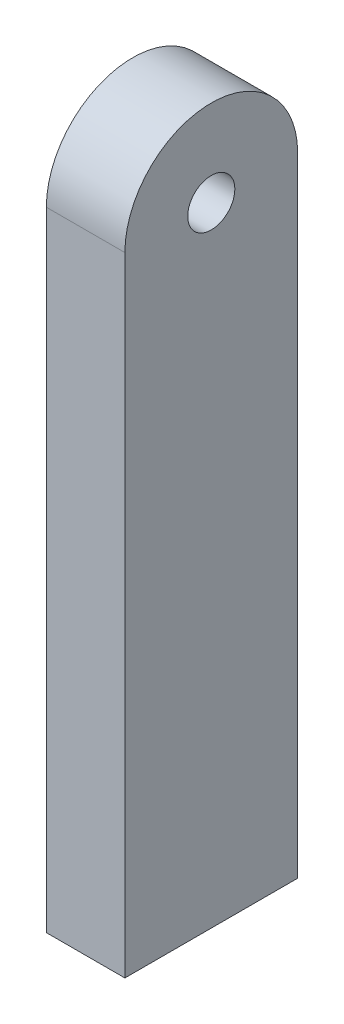
ISO-10303-21;
HEADER;
FILE_DESCRIPTION(('STEP AP214'),'2;1');
FILE_NAME('part.step','',(''),(''),'','','');
FILE_SCHEMA(('AUTOMOTIVE_DESIGN { 1 0 10303 214 1 1 1 1 }'));
ENDSEC;
DATA;
#1=APPLICATION_CONTEXT('core data for automotive mechanical design processes');
#2=APPLICATION_PROTOCOL_DEFINITION('international standard','automotive_design',2000,#1);
#3=PRODUCT_CONTEXT('',#1,'mechanical');
#4=PRODUCT('Part','Part','',(#3));
#5=PRODUCT_RELATED_PRODUCT_CATEGORY('part','',(#4));
#6=PRODUCT_DEFINITION_FORMATION('','',#4);
#7=PRODUCT_DEFINITION_CONTEXT('part definition',#1,'design');
#8=PRODUCT_DEFINITION('design','',#6,#7);
#9=PRODUCT_DEFINITION_SHAPE('','',#8);
#10=(LENGTH_UNIT() NAMED_UNIT(*) SI_UNIT(.MILLI.,.METRE.));
#11=(NAMED_UNIT(*) PLANE_ANGLE_UNIT() SI_UNIT($,.RADIAN.));
#12=(NAMED_UNIT(*) SI_UNIT($,.STERADIAN.) SOLID_ANGLE_UNIT());
#13=UNCERTAINTY_MEASURE_WITH_UNIT(LENGTH_MEASURE(1.E-05),#10,'distance_accuracy_value','');
#14=(GEOMETRIC_REPRESENTATION_CONTEXT(3) GLOBAL_UNCERTAINTY_ASSIGNED_CONTEXT((#13)) GLOBAL_UNIT_ASSIGNED_CONTEXT((#10,
#11,#12)) REPRESENTATION_CONTEXT('',''));
#15=CARTESIAN_POINT('',(0.,0.,0.));
#16=DIRECTION('',(0.,0.,1.));
#17=DIRECTION('',(1.,0.,0.));
#18=AXIS2_PLACEMENT_3D('',#15,#16,#17);
#19=CARTESIAN_POINT('',(5.,20.,0.));
#20=DIRECTION('',(1.,0.,0.));
#21=DIRECTION('',(0.,0.,-1.));
#22=AXIS2_PLACEMENT_3D('',#19,#20,#21);
#23=PLANE('',#22);
#24=CARTESIAN_POINT('',(5.,20.,0.));
#25=DIRECTION('',(1.,0.,0.));
#26=DIRECTION('',(0.,0.,-1.));
#27=AXIS2_PLACEMENT_3D('',#24,#25,#26);
#28=CIRCLE('',#27,5.49999999999999);
#29=CARTESIAN_POINT('',(5.,20.,-5.49999999999999));
#30=VERTEX_POINT('',#29);
#31=CARTESIAN_POINT('',(5.,20.,5.49999999999999));
#32=VERTEX_POINT('',#31);
#33=EDGE_CURVE('E94',#30,#32,#28,.T.);
#34=ORIENTED_EDGE('',*,*,#33,.T.);
#35=DIRECTION('',(0.,-1.,0.));
#36=VECTOR('',#35,1.);
#37=CARTESIAN_POINT('',(5.,20.,5.49999999999999));
#38=LINE('',#37,#36);
#39=CARTESIAN_POINT('',(5.,-20.,5.49999999999998));
#40=VERTEX_POINT('',#39);
#41=EDGE_CURVE('E89',#32,#40,#38,.T.);
#42=ORIENTED_EDGE('',*,*,#41,.T.);
#43=DIRECTION('',(0.,0.,-1.));
#44=VECTOR('',#43,1.);
#45=CARTESIAN_POINT('',(5.,-20.,5.49999999999998));
#46=LINE('',#45,#44);
#47=CARTESIAN_POINT('',(5.,-20.,-5.50000000000001));
#48=VERTEX_POINT('',#47);
#49=EDGE_CURVE('E92',#40,#48,#46,.T.);
#50=ORIENTED_EDGE('',*,*,#49,.T.);
#51=DIRECTION('',(0.,1.,0.));
#52=VECTOR('',#51,1.);
#53=CARTESIAN_POINT('',(5.,20.,-5.49999999999999));
#54=LINE('',#53,#52);
#55=EDGE_CURVE('E59',#48,#30,#54,.T.);
#56=ORIENTED_EDGE('',*,*,#55,.T.);
#57=EDGE_LOOP('',(#34,#42,#50,#56));
#58=FACE_BOUND('',#57,.T.);
#59=CARTESIAN_POINT('',(5.,20.,0.));
#60=DIRECTION('',(1.,0.,0.));
#61=DIRECTION('',(0.,0.,-1.));
#62=AXIS2_PLACEMENT_3D('',#59,#60,#61);
#63=CIRCLE('',#62,1.5);
#64=CARTESIAN_POINT('',(5.,20.,-1.49999999999999));
#65=VERTEX_POINT('',#64);
#66=EDGE_CURVE('E114',#65,#65,#63,.T.);
#67=ORIENTED_EDGE('',*,*,#66,.F.);
#68=EDGE_LOOP('',(#67));
#69=FACE_BOUND('',#68,.T.);
#70=ADVANCED_FACE('F41',(#58,#69),#23,.T.);
#71=CARTESIAN_POINT('',(0.,20.,0.));
#72=DIRECTION('',(1.,0.,0.));
#73=DIRECTION('',(0.,0.,-1.));
#74=AXIS2_PLACEMENT_3D('',#71,#72,#73);
#75=PLANE('',#74);
#76=CARTESIAN_POINT('',(0.,20.,0.));
#77=DIRECTION('',(1.,0.,0.));
#78=DIRECTION('',(0.,0.,-1.));
#79=AXIS2_PLACEMENT_3D('',#76,#77,#78);
#80=CIRCLE('',#79,5.49999999999999);
#81=CARTESIAN_POINT('',(0.,20.,-5.49999999999999));
#82=VERTEX_POINT('',#81);
#83=CARTESIAN_POINT('',(0.,20.,5.49999999999999));
#84=VERTEX_POINT('',#83);
#85=EDGE_CURVE('E110',#82,#84,#80,.T.);
#86=ORIENTED_EDGE('',*,*,#85,.F.);
#87=DIRECTION('',(0.,1.,0.));
#88=VECTOR('',#87,1.);
#89=CARTESIAN_POINT('',(0.,20.,-5.49999999999999));
#90=LINE('',#89,#88);
#91=CARTESIAN_POINT('',(0.,-20.,-5.50000000000001));
#92=VERTEX_POINT('',#91);
#93=EDGE_CURVE('E82',#92,#82,#90,.T.);
#94=ORIENTED_EDGE('',*,*,#93,.F.);
#95=DIRECTION('',(0.,0.,-1.));
#96=VECTOR('',#95,1.);
#97=CARTESIAN_POINT('',(0.,-20.,5.49999999999998));
#98=LINE('',#97,#96);
#99=CARTESIAN_POINT('',(0.,-20.,5.49999999999998));
#100=VERTEX_POINT('',#99);
#101=EDGE_CURVE('E76',#100,#92,#98,.T.);
#102=ORIENTED_EDGE('',*,*,#101,.F.);
#103=DIRECTION('',(0.,-1.,0.));
#104=VECTOR('',#103,1.);
#105=CARTESIAN_POINT('',(0.,20.,5.49999999999999));
#106=LINE('',#105,#104);
#107=EDGE_CURVE('E99',#84,#100,#106,.T.);
#108=ORIENTED_EDGE('',*,*,#107,.F.);
#109=EDGE_LOOP('',(#86,#94,#102,#108));
#110=FACE_BOUND('',#109,.T.);
#111=CARTESIAN_POINT('',(0.,20.,0.));
#112=DIRECTION('',(1.,0.,0.));
#113=DIRECTION('',(0.,0.,-1.));
#114=AXIS2_PLACEMENT_3D('',#111,#112,#113);
#115=CIRCLE('',#114,1.5);
#116=CARTESIAN_POINT('',(0.,20.,-1.49999999999999));
#117=VERTEX_POINT('',#116);
#118=EDGE_CURVE('E132',#117,#117,#115,.T.);
#119=ORIENTED_EDGE('',*,*,#118,.T.);
#120=EDGE_LOOP('',(#119));
#121=FACE_BOUND('',#120,.T.);
#122=ADVANCED_FACE('F127',(#110,#121),#75,.F.);
#123=CARTESIAN_POINT('',(5.,20.,0.));
#124=DIRECTION('',(-1.,0.,0.));
#125=DIRECTION('',(0.,0.,1.));
#126=AXIS2_PLACEMENT_3D('',#123,#124,#125);
#127=CYLINDRICAL_SURFACE('',#126,5.49999999999999);
#128=ORIENTED_EDGE('',*,*,#85,.T.);
#129=DIRECTION('',(-1.,0.,0.));
#130=VECTOR('',#129,1.);
#131=CARTESIAN_POINT('',(5.,20.,5.49999999999999));
#132=LINE('',#131,#130);
#133=EDGE_CURVE('E12',#32,#84,#132,.T.);
#134=ORIENTED_EDGE('',*,*,#133,.F.);
#135=ORIENTED_EDGE('',*,*,#33,.F.);
#136=DIRECTION('',(-1.,0.,0.));
#137=VECTOR('',#136,1.);
#138=CARTESIAN_POINT('',(5.,20.,-5.49999999999999));
#139=LINE('',#138,#137);
#140=EDGE_CURVE('E106',#30,#82,#139,.T.);
#141=ORIENTED_EDGE('',*,*,#140,.T.);
#142=EDGE_LOOP('',(#128,#134,#135,#141));
#143=FACE_BOUND('',#142,.T.);
#144=ADVANCED_FACE('F43',(#143),#127,.T.);
#145=CARTESIAN_POINT('',(5.,20.,5.49999999999999));
#146=DIRECTION('',(0.,0.,-1.));
#147=DIRECTION('',(0.,1.,0.));
#148=AXIS2_PLACEMENT_3D('',#145,#146,#147);
#149=PLANE('',#148);
#150=ORIENTED_EDGE('',*,*,#107,.T.);
#151=DIRECTION('',(-1.,0.,0.));
#152=VECTOR('',#151,1.);
#153=CARTESIAN_POINT('',(5.,-20.,5.49999999999998));
#154=LINE('',#153,#152);
#155=EDGE_CURVE('E51',#40,#100,#154,.T.);
#156=ORIENTED_EDGE('',*,*,#155,.F.);
#157=ORIENTED_EDGE('',*,*,#41,.F.);
#158=ORIENTED_EDGE('',*,*,#133,.T.);
#159=EDGE_LOOP('',(#150,#156,#157,#158));
#160=FACE_BOUND('',#159,.T.);
#161=ADVANCED_FACE('F98',(#160),#149,.F.);
#162=CARTESIAN_POINT('',(5.,-20.,5.49999999999998));
#163=DIRECTION('',(0.,1.,0.));
#164=DIRECTION('',(0.,0.,1.));
#165=AXIS2_PLACEMENT_3D('',#162,#163,#164);
#166=PLANE('',#165);
#167=CARTESIAN_POINT('',(2.5,-20.,0.));
#168=DIRECTION('',(0.,-1.,0.));
#169=DIRECTION('',(0.,0.,-1.));
#170=AXIS2_PLACEMENT_3D('',#167,#168,#169);
#171=CIRCLE('',#170,2.);
#172=CARTESIAN_POINT('',(2.5,-20.,-2.00000000000001));
#173=VERTEX_POINT('',#172);
#174=EDGE_CURVE('E148',#173,#173,#171,.T.);
#175=ORIENTED_EDGE('',*,*,#174,.F.);
#176=EDGE_LOOP('',(#175));
#177=FACE_BOUND('',#176,.T.);
#178=ORIENTED_EDGE('',*,*,#101,.T.);
#179=DIRECTION('',(-1.,0.,0.));
#180=VECTOR('',#179,1.);
#181=CARTESIAN_POINT('',(5.,-20.,-5.50000000000001));
#182=LINE('',#181,#180);
#183=EDGE_CURVE('E101',#48,#92,#182,.T.);
#184=ORIENTED_EDGE('',*,*,#183,.F.);
#185=ORIENTED_EDGE('',*,*,#49,.F.);
#186=ORIENTED_EDGE('',*,*,#155,.T.);
#187=EDGE_LOOP('',(#178,#184,#185,#186));
#188=FACE_BOUND('',#187,.T.);
#189=ADVANCED_FACE('F102',(#177,#188),#166,.F.);
#190=CARTESIAN_POINT('',(5.,20.,-5.49999999999999));
#191=DIRECTION('',(0.,0.,1.));
#192=DIRECTION('',(0.,-1.,0.));
#193=AXIS2_PLACEMENT_3D('',#190,#191,#192);
#194=PLANE('',#193);
#195=ORIENTED_EDGE('',*,*,#93,.T.);
#196=ORIENTED_EDGE('',*,*,#140,.F.);
#197=ORIENTED_EDGE('',*,*,#55,.F.);
#198=ORIENTED_EDGE('',*,*,#183,.T.);
#199=EDGE_LOOP('',(#195,#196,#197,#198));
#200=FACE_BOUND('',#199,.T.);
#201=ADVANCED_FACE('F124',(#200),#194,.F.);
#202=CARTESIAN_POINT('',(5.,20.,0.));
#203=DIRECTION('',(-1.,0.,0.));
#204=DIRECTION('',(0.,0.,1.));
#205=AXIS2_PLACEMENT_3D('',#202,#203,#204);
#206=CYLINDRICAL_SURFACE('',#205,1.5);
#207=ORIENTED_EDGE('',*,*,#66,.T.);
#208=EDGE_LOOP('',(#207));
#209=FACE_BOUND('',#208,.T.);
#210=ORIENTED_EDGE('',*,*,#118,.F.);
#211=EDGE_LOOP('',(#210));
#212=FACE_BOUND('',#211,.T.);
#213=ADVANCED_FACE('F159',(#209,#212),#206,.F.);
#214=CARTESIAN_POINT('',(2.5,35.501,0.));
#215=DIRECTION('',(0.,-1.,0.));
#216=DIRECTION('',(0.,0.,-1.));
#217=AXIS2_PLACEMENT_3D('',#214,#215,#216);
#218=CYLINDRICAL_SURFACE('',#217,2.);
#219=ORIENTED_EDGE('',*,*,#174,.T.);
#220=EDGE_LOOP('',(#219));
#221=FACE_BOUND('',#220,.T.);
#222=CARTESIAN_POINT('',(2.5,13.8153415615735,-2.00000000000001));
#223=CARTESIAN_POINT('',(2.60944781666523,13.8153406980381,-1.99999900955681));
#224=CARTESIAN_POINT('',(2.71890548483824,13.812404480373,-1.99098535833567));
#225=CARTESIAN_POINT('',(2.93461118168521,13.8010268251306,-1.95526805100873));
#226=CARTESIAN_POINT('',(3.04085825446286,13.7925837645639,-1.92855917969019));
#227=CARTESIAN_POINT('',(3.24698780797404,13.771237260294,-1.85845185053106));
#228=CARTESIAN_POINT('',(3.34688094075819,13.7583415278522,-1.81508223171292));
#229=CARTESIAN_POINT('',(3.53799985089879,13.7295533097301,-1.71298018316395));
#230=CARTESIAN_POINT('',(3.62922418323406,13.7136603257447,-1.6542451982494));
#231=CARTESIAN_POINT('',(3.80345356947202,13.6800748051334,-1.52098542811859));
#232=CARTESIAN_POINT('',(3.88612742349219,13.6623424306716,-1.44603755808563));
#233=CARTESIAN_POINT('',(4.03795371808371,13.6274156156963,-1.28338536224741));
#234=CARTESIAN_POINT('',(4.107104329982,13.6102212481982,-1.19567931401688));
#235=CARTESIAN_POINT('',(4.23137363799946,13.5778533289091,-1.00762969104174));
#236=CARTESIAN_POINT('',(4.28615256785287,13.5627321660914,-0.907051779246712));
#237=CARTESIAN_POINT('',(4.37788894200936,13.5366786925517,-0.697566498611652));
#238=CARTESIAN_POINT('',(4.41485044031837,13.525745429072,-0.588661031083101));
#239=CARTESIAN_POINT('',(4.46880071461249,13.5095815769342,-0.369078789668976));
#240=CARTESIAN_POINT('',(4.48635527672199,13.5041897849757,-0.258553108996829));
#241=CARTESIAN_POINT('',(4.50278460642675,13.4991476815327,-0.0360024805210136));
#242=CARTESIAN_POINT('',(4.50166349455574,13.4994961035478,0.0760221311138205));
#243=CARTESIAN_POINT('',(4.48114844527175,13.5057822621267,0.294413564221139));
#244=CARTESIAN_POINT('',(4.46236759529849,13.5115324605833,0.400844233271015));
#245=CARTESIAN_POINT('',(4.40807040958313,13.5277464811044,0.608962506037085));
#246=CARTESIAN_POINT('',(4.37255299402721,13.5382106073015,0.710649803253979));
#247=CARTESIAN_POINT('',(4.28538875658138,13.5629313903954,0.907825983957039));
#248=CARTESIAN_POINT('',(4.23355326091788,13.5772321053959,1.00322571036046));
#249=CARTESIAN_POINT('',(4.11537480759449,13.6081153744451,1.18416561152013));
#250=CARTESIAN_POINT('',(4.04902826808112,13.6246984914984,1.26970334400254));
#251=CARTESIAN_POINT('',(3.90055088932973,13.6591696364395,1.43214818143838));
#252=CARTESIAN_POINT('',(3.81789001491942,13.6770833142205,1.50856604633593));
#253=CARTESIAN_POINT('',(3.64075606067757,13.7116145908932,1.64659789158782));
#254=CARTESIAN_POINT('',(3.54628167826867,13.7282320465328,1.7082102372684));
#255=CARTESIAN_POINT('',(3.34685693175614,13.758416159191,1.81542815284784));
#256=CARTESIAN_POINT('',(3.24180658521937,13.7719487903187,1.86085804249381));
#257=CARTESIAN_POINT('',(3.0250312826704,13.7940302103603,1.93323233909797));
#258=CARTESIAN_POINT('',(2.91330865283467,13.8025807251493,1.96018314804152));
#259=CARTESIAN_POINT('',(2.69103547184524,13.8133483671641,1.99390183839658));
#260=CARTESIAN_POINT('',(2.58060951976731,13.8157997764461,2.00141677206858));
#261=CARTESIAN_POINT('',(2.36006861403926,13.8147410970507,1.99814331840787));
#262=CARTESIAN_POINT('',(2.24995361655913,13.8112318953566,1.98735765434066));
#263=CARTESIAN_POINT('',(2.03633739526088,13.7988781697913,1.94845591378717));
#264=CARTESIAN_POINT('',(1.93273743020314,13.7901844525026,1.920829221027));
#265=CARTESIAN_POINT('',(1.73165311791169,13.7685996656825,1.84960144317457));
#266=CARTESIAN_POINT('',(1.63416975068449,13.7557079255781,1.80599780585852));
#267=CARTESIAN_POINT('',(1.44506908836895,13.7267317645147,1.7026608363221));
#268=CARTESIAN_POINT('',(1.35369214786031,13.7105681259801,1.64251044768899));
#269=CARTESIAN_POINT('',(1.18205645444877,13.6770357914079,1.50827755720533));
#270=CARTESIAN_POINT('',(1.10180051059716,13.6596667925652,1.43419154645755));
#271=CARTESIAN_POINT('',(0.951375421363223,13.6248401725481,1.27066455897643));
#272=CARTESIAN_POINT('',(0.881738052298869,13.607406788594,1.180727981271));
#273=CARTESIAN_POINT('',(0.758525963856622,13.5751119501141,0.990026292988473));
#274=CARTESIAN_POINT('',(0.70495048188052,13.5602503734964,0.889261696820756));
#275=CARTESIAN_POINT('',(0.615898897000582,13.5348610448859,0.680404349890919));
#276=CARTESIAN_POINT('',(0.580289858397727,13.5243015766907,0.572372332564435));
#277=CARTESIAN_POINT('',(0.527858234244308,13.5085664629849,0.351472208803086));
#278=CARTESIAN_POINT('',(0.511029966898515,13.5033891892177,0.238605575732796));
#279=CARTESIAN_POINT('',(0.497087749383018,13.4991062897126,0.0161425784558901));
#280=CARTESIAN_POINT('',(0.499204508816275,13.499763727622,-0.0934015930792436));
#281=CARTESIAN_POINT('',(0.521240197505204,13.5065123898386,-0.310503921550136));
#282=CARTESIAN_POINT('',(0.541158025873126,13.51260327812,-0.418062200881398));
#283=CARTESIAN_POINT('',(0.597745812243795,13.5294623459109,-0.626896153328715));
#284=CARTESIAN_POINT('',(0.634215246676873,13.5401744642709,-0.728231001104451));
#285=CARTESIAN_POINT('',(0.722690633983229,13.5651702566563,-0.923394028801668));
#286=CARTESIAN_POINT('',(0.774699210789222,13.5794545338084,-1.01722093754077));
#287=CARTESIAN_POINT('',(0.894774736319075,13.6106898593971,-1.19809140790343));
#288=CARTESIAN_POINT('',(0.963317333802997,13.627713677683,-1.2848065111501));
#289=CARTESIAN_POINT('',(1.11366948951744,13.6622900187677,-1.44576009155787));
#290=CARTESIAN_POINT('',(1.19548295904986,13.6798426961907,-1.51999487724008));
#291=CARTESIAN_POINT('',(1.37317697614795,13.7141504863243,-1.65626040321866));
#292=CARTESIAN_POINT('',(1.4694223551431,13.7308624365178,-1.71782754366814));
#293=CARTESIAN_POINT('',(1.67139075347286,13.7608772568111,-1.82384213502381));
#294=CARTESIAN_POINT('',(1.77710963003581,13.7741816073324,-1.86829702453286));
#295=CARTESIAN_POINT('',(1.98478819820058,13.7946964305021,-1.93528263381639));
#296=CARTESIAN_POINT('',(2.08616631120831,13.8023623509031,-1.95948210366416));
#297=CARTESIAN_POINT('',(2.29169373301637,13.8126847570915,-1.99183943194678));
#298=CARTESIAN_POINT('',(2.39584240542432,13.8153423833695,-2.00000094256958));
#299=CARTESIAN_POINT('',(2.5,13.8153415615735,-2.00000000000001));
#300=B_SPLINE_CURVE_WITH_KNOTS('',3,(#222,#223,#224,#225,#226,#227,#228,#229,#230,#231,#232,
#233,#234,#235,#236,#237,#238,#239,#240,#241,#242,#243,#244,#245,#246,#247,#248,#249,#250,#251,
#252,#253,#254,#255,#256,#257,#258,#259,#260,#261,#262,#263,#264,#265,#266,#267,#268,#269,#270,
#271,#272,#273,#274,#275,#276,#277,#278,#279,#280,#281,#282,#283,#284,#285,#286,#287,#288,#289,
#290,#291,#292,#293,#294,#295,#296,#297,#298,#299),.UNSPECIFIED.,.T.,.F.,(4,2,2,2,2,2,2,2,2,2,2,
2,2,2,2,2,2,2,2,2,2,2,2,2,2,2,2,2,2,2,2,2,2,2,2,2,2,2,4),(0.,0.327958904824529,
0.656014510157335,0.983504805826269,1.31104959615494,1.64848092871026,1.9859578587312,
2.33081172384084,2.67558708716039,3.0100217177641,3.34438256088806,3.66754797200326,
3.9907342360384,4.31780371544651,4.64495401879589,4.98534121479608,5.32576597561374,
5.66978125697087,6.01367729564791,6.34414407424119,6.6745616812246,6.99580726669394,
7.31710419166199,7.64738828171958,7.97775564671482,8.32133560221228,8.66489924238099,
9.00588210329356,9.34676177779275,9.67386437135672,10.0009467370162,10.3241681048257,
10.6474440825282,10.9814486359996,11.3155518095369,11.6602881883484,12.0048745424384,
12.3170524660658,12.6291592918299),.UNSPECIFIED.);
#301=CARTESIAN_POINT('',(2.5,13.8153415615735,-2.00000000000001));
#302=VERTEX_POINT('',#301);
#303=EDGE_CURVE('E136',#302,#302,#300,.T.);
#304=ORIENTED_EDGE('',*,*,#303,.F.);
#305=EDGE_LOOP('',(#304));
#306=FACE_BOUND('',#305,.T.);
#307=ADVANCED_FACE('F149',(#221,#306),#218,.F.);
#308=CARTESIAN_POINT('',(5.,20.,0.));
#309=DIRECTION('',(-1.,0.,0.));
#310=DIRECTION('',(0.,0.,1.));
#311=AXIS2_PLACEMENT_3D('',#308,#309,#310);
#312=CYLINDRICAL_SURFACE('',#311,6.5);
#313=ORIENTED_EDGE('',*,*,#303,.T.);
#314=EDGE_LOOP('',(#313));
#315=FACE_BOUND('',#314,.T.);
#316=ADVANCED_FACE('F152',(#315),#312,.T.);
#317=CLOSED_SHELL('',(#70,#122,#144,#161,#189,#201,#213,#307,#316));
#318=MANIFOLD_SOLID_BREP('B2',#317);
#319=ADVANCED_BREP_SHAPE_REPRESENTATION('',(#18,#318),#14);
#320=SHAPE_DEFINITION_REPRESENTATION(#9,#319);
ENDSEC;
END-ISO-10303-21;
